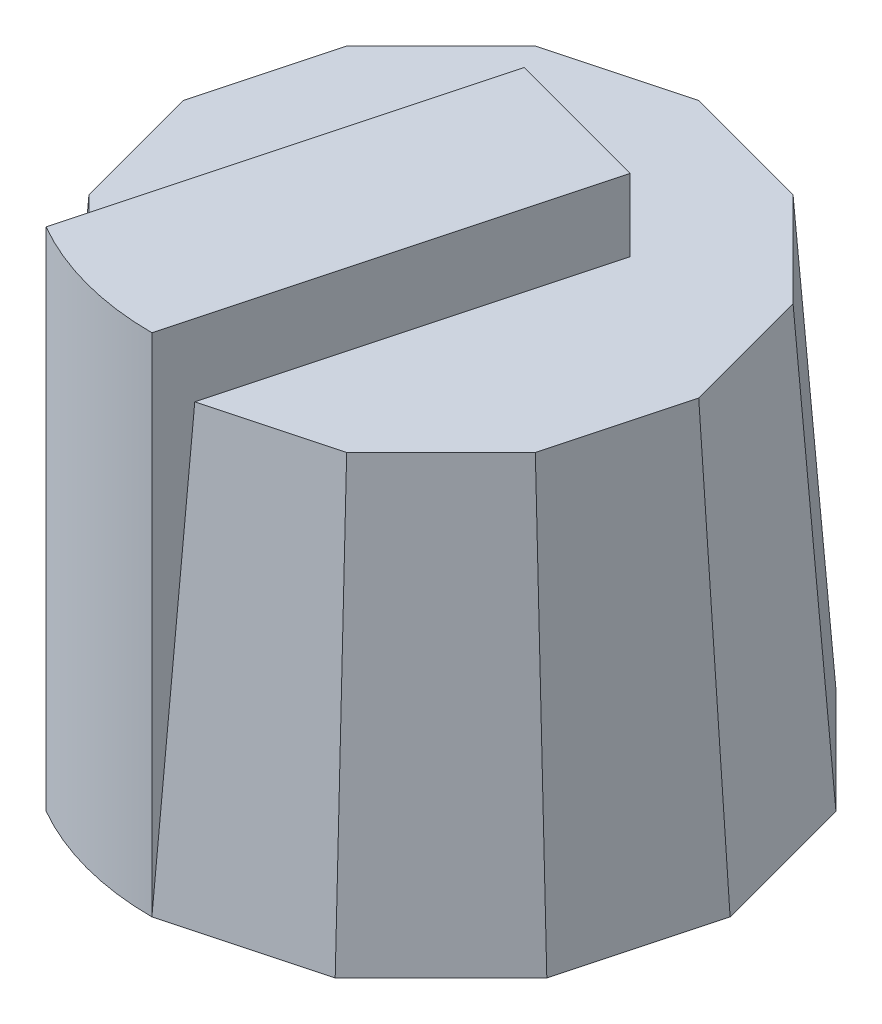
ISO-10303-21;
HEADER;
FILE_DESCRIPTION(('STEP AP214'),'2;1');
FILE_NAME('part.step','',(''),(''),'','','');
FILE_SCHEMA(('AUTOMOTIVE_DESIGN { 1 0 10303 214 1 1 1 1 }'));
ENDSEC;
DATA;
#1=APPLICATION_CONTEXT('core data for automotive mechanical design processes');
#2=APPLICATION_PROTOCOL_DEFINITION('international standard','automotive_design',2000,#1);
#3=PRODUCT_CONTEXT('',#1,'mechanical');
#4=PRODUCT('Part','Part','',(#3));
#5=PRODUCT_RELATED_PRODUCT_CATEGORY('part','',(#4));
#6=PRODUCT_DEFINITION_FORMATION('','',#4);
#7=PRODUCT_DEFINITION_CONTEXT('part definition',#1,'design');
#8=PRODUCT_DEFINITION('design','',#6,#7);
#9=PRODUCT_DEFINITION_SHAPE('','',#8);
#10=(LENGTH_UNIT() NAMED_UNIT(*) SI_UNIT(.MILLI.,.METRE.));
#11=(NAMED_UNIT(*) PLANE_ANGLE_UNIT() SI_UNIT($,.RADIAN.));
#12=(NAMED_UNIT(*) SI_UNIT($,.STERADIAN.) SOLID_ANGLE_UNIT());
#13=UNCERTAINTY_MEASURE_WITH_UNIT(LENGTH_MEASURE(1.E-05),#10,'distance_accuracy_value','');
#14=(GEOMETRIC_REPRESENTATION_CONTEXT(3) GLOBAL_UNCERTAINTY_ASSIGNED_CONTEXT((#13)) GLOBAL_UNIT_ASSIGNED_CONTEXT((#10,
#11,#12)) REPRESENTATION_CONTEXT('',''));
#15=CARTESIAN_POINT('',(0.,0.,0.));
#16=DIRECTION('',(0.,0.,1.));
#17=DIRECTION('',(1.,0.,0.));
#18=AXIS2_PLACEMENT_3D('',#15,#16,#17);
#19=CARTESIAN_POINT('',(-17.3205080756887,0.,10.0000000000001));
#20=DIRECTION('',(-0.705384304606635,0.0697564737441253,0.705384304606645));
#21=DIRECTION('',(0.707106781186553,0.,0.707106781186543));
#22=AXIS2_PLACEMENT_3D('',#19,#20,#21);
#23=PLANE('',#22);
#24=DIRECTION('',(0.020830427948224,0.99675601436554,-0.0777402154461769));
#25=VECTOR('',#24,1.);
#26=CARTESIAN_POINT('',(-9.99132186542976,0.415257086784016,17.2881208365582));
#27=LINE('',#26,#25);
#28=CARTESIAN_POINT('',(-9.3730533556453,30.,14.9807113453227));
#29=VERTEX_POINT('',#28);
#30=CARTESIAN_POINT('',(-9.99999999999987,0.,17.3205080756888));
#31=VERTEX_POINT('',#30);
#32=EDGE_CURVE('E216',#29,#31,#27,.F.);
#33=ORIENTED_EDGE('',*,*,#32,.F.);
#34=DIRECTION('',(-0.707106781186553,0.,-0.707106781186543));
#35=VECTOR('',#34,1.);
#36=CARTESIAN_POINT('',(-15.8371363883283,30.,8.51662831263974));
#37=LINE('',#36,#35);
#38=CARTESIAN_POINT('',(-15.4396681426249,30.,8.91409655834314));
#39=VERTEX_POINT('',#38);
#40=EDGE_CURVE('E308',#39,#29,#37,.F.);
#41=ORIENTED_EDGE('',*,*,#40,.F.);
#42=DIRECTION('',(-0.0625310213997539,-0.997389841110421,0.0361023020378508));
#43=VECTOR('',#42,1.);
#44=CARTESIAN_POINT('',(-17.3205080756887,0.,10.0000000000001));
#45=LINE('',#44,#43);
#46=CARTESIAN_POINT('',(-17.3205080756887,0.,10.0000000000001));
#47=VERTEX_POINT('',#46);
#48=EDGE_CURVE('E257',#39,#47,#45,.T.);
#49=ORIENTED_EDGE('',*,*,#48,.T.);
#50=DIRECTION('',(0.707106781186553,0.,0.707106781186542));
#51=VECTOR('',#50,1.);
#52=CARTESIAN_POINT('',(-17.3205080756887,0.,10.0000000000001));
#53=LINE('',#52,#51);
#54=EDGE_CURVE('E183',#47,#31,#53,.T.);
#55=ORIENTED_EDGE('',*,*,#54,.T.);
#56=EDGE_LOOP('',(#33,#41,#49,#55));
#57=FACE_BOUND('',#56,.T.);
#58=ADVANCED_FACE('F39',(#57),#23,.T.);
#59=CARTESIAN_POINT('',(1.4658413372004E-13,0.,20.));
#60=DIRECTION('',(0.258188574916858,0.0697564737441253,0.963572879523489));
#61=DIRECTION('',(0.965925826289066,0.,-0.258819045102528));
#62=AXIS2_PLACEMENT_3D('',#59,#60,#61);
#63=PLANE('',#62);
#64=DIRECTION('',(-0.0208304279482239,-0.99675601436554,0.0777402154461768));
#65=VECTOR('',#64,1.);
#66=CARTESIAN_POINT('',(1.4658413372004E-13,0.,20.));
#67=LINE('',#66,#65);
#68=CARTESIAN_POINT('',(1.63931368479808E-13,0.,20.));
#69=VERTEX_POINT('',#68);
#70=CARTESIAN_POINT('',(0.626946644354719,30.,17.6602032696338));
#71=VERTEX_POINT('',#70);
#72=EDGE_CURVE('E151',#69,#71,#67,.F.);
#73=ORIENTED_EDGE('',*,*,#72,.F.);
#74=DIRECTION('',(0.965925826289066,0.,-0.258819045102528));
#75=VECTOR('',#74,1.);
#76=CARTESIAN_POINT('',(1.4658413372004E-13,0.,20.));
#77=LINE('',#76,#75);
#78=CARTESIAN_POINT('',(10.0000000000001,0.,17.3205080756887));
#79=VERTEX_POINT('',#78);
#80=EDGE_CURVE('E168',#69,#79,#77,.T.);
#81=ORIENTED_EDGE('',*,*,#80,.T.);
#82=DIRECTION('',(0.0361023020378508,-0.997389841110421,0.0625310213997539));
#83=VECTOR('',#82,1.);
#84=CARTESIAN_POINT('',(10.0000000000001,0.,17.3205080756887));
#85=LINE('',#84,#83);
#86=CARTESIAN_POINT('',(8.91409655834314,30.,15.4396681426249));
#87=VERTEX_POINT('',#86);
#88=EDGE_CURVE('E254',#87,#79,#85,.T.);
#89=ORIENTED_EDGE('',*,*,#88,.F.);
#90=DIRECTION('',(-0.965925826289066,0.,0.258819045102528));
#91=VECTOR('',#90,1.);
#92=CARTESIAN_POINT('',(-0.542951720828356,30.,17.9736765918111));
#93=LINE('',#92,#91);
#94=EDGE_CURVE('E170',#71,#87,#93,.F.);
#95=ORIENTED_EDGE('',*,*,#94,.F.);
#96=EDGE_LOOP('',(#73,#81,#89,#95));
#97=FACE_BOUND('',#96,.T.);
#98=ADVANCED_FACE('F166',(#97),#63,.T.);
#99=CARTESIAN_POINT('',(0.,30.,0.));
#100=DIRECTION('',(0.,1.,0.));
#101=DIRECTION('',(0.,0.,1.));
#102=AXIS2_PLACEMENT_3D('',#99,#100,#101);
#103=PLANE('',#102);
#104=ORIENTED_EDGE('',*,*,#40,.T.);
#105=DIRECTION('',(0.258819045102512,0.,-0.965925826289071));
#106=VECTOR('',#105,1.);
#107=CARTESIAN_POINT('',(-5.00000000000006,30.,-1.33974596215558));
#108=LINE('',#107,#106);
#109=CARTESIAN_POINT('',(-3.01188578223208,30.,-8.75948923411603));
#110=VERTEX_POINT('',#109);
#111=EDGE_CURVE('E62',#29,#110,#108,.T.);
#112=ORIENTED_EDGE('',*,*,#111,.T.);
#113=DIRECTION('',(0.965925826289071,0.,0.258819045102512));
#114=VECTOR('',#113,1.);
#115=CARTESIAN_POINT('',(1.98811421776798,30.,-7.41974327196045));
#116=LINE('',#115,#114);
#117=CARTESIAN_POINT('',(6.98811421776796,30.,-6.07999730980489));
#118=VERTEX_POINT('',#117);
#119=EDGE_CURVE('E57',#110,#118,#116,.T.);
#120=ORIENTED_EDGE('',*,*,#119,.T.);
#121=DIRECTION('',(-0.258819045102512,0.,0.965925826289071));
#122=VECTOR('',#121,1.);
#123=CARTESIAN_POINT('',(4.99999999999997,30.,1.33974596215555));
#124=LINE('',#123,#122);
#125=EDGE_CURVE('E172',#118,#71,#124,.T.);
#126=ORIENTED_EDGE('',*,*,#125,.T.);
#127=ORIENTED_EDGE('',*,*,#94,.T.);
#128=DIRECTION('',(-0.707106781186542,0.,0.707106781186553));
#129=VECTOR('',#128,1.);
#130=CARTESIAN_POINT('',(8.51662831263974,30.,15.8371363883283));
#131=LINE('',#130,#129);
#132=CARTESIAN_POINT('',(15.4396681426251,30.,8.91409655834292));
#133=VERTEX_POINT('',#132);
#134=EDGE_CURVE('E43',#87,#133,#131,.F.);
#135=ORIENTED_EDGE('',*,*,#134,.T.);
#136=DIRECTION('',(-0.258819045102513,0.,0.96592582628907));
#137=VECTOR('',#136,1.);
#138=CARTESIAN_POINT('',(15.2941846675,30.,9.45704827917141));
#139=LINE('',#138,#137);
#140=CARTESIAN_POINT('',(17.828193116686,30.,-1.37885821796515E-13));
#141=VERTEX_POINT('',#140);
#142=EDGE_CURVE('E248',#133,#141,#139,.F.);
#143=ORIENTED_EDGE('',*,*,#142,.T.);
#144=DIRECTION('',(0.258819045102528,0.,0.965925826289066));
#145=VECTOR('',#144,1.);
#146=CARTESIAN_POINT('',(17.9736765918111,30.,0.542951720828348));
#147=LINE('',#146,#145);
#148=CARTESIAN_POINT('',(15.4396681426249,30.,-8.91409655834316));
#149=VERTEX_POINT('',#148);
#150=EDGE_CURVE('E287',#141,#149,#147,.F.);
#151=ORIENTED_EDGE('',*,*,#150,.T.);
#152=DIRECTION('',(0.707106781186554,0.,0.707106781186541));
#153=VECTOR('',#152,1.);
#154=CARTESIAN_POINT('',(15.8371363883283,30.,-8.51662831263976));
#155=LINE('',#154,#153);
#156=CARTESIAN_POINT('',(8.91409655834286,30.,-15.4396681426251));
#157=VERTEX_POINT('',#156);
#158=EDGE_CURVE('E290',#149,#157,#155,.F.);
#159=ORIENTED_EDGE('',*,*,#158,.T.);
#160=DIRECTION('',(0.965925826289071,0.,0.258819045102511));
#161=VECTOR('',#160,1.);
#162=CARTESIAN_POINT('',(9.45704827917135,30.,-15.2941846675));
#163=LINE('',#162,#161);
#164=CARTESIAN_POINT('',(-1.574747435523E-13,30.,-17.8281931166861));
#165=VERTEX_POINT('',#164);
#166=EDGE_CURVE('E293',#157,#165,#163,.F.);
#167=ORIENTED_EDGE('',*,*,#166,.T.);
#168=DIRECTION('',(0.965925826289066,0.,-0.258819045102528));
#169=VECTOR('',#168,1.);
#170=CARTESIAN_POINT('',(0.542951720828326,30.,-17.9736765918111));
#171=LINE('',#170,#169);
#172=CARTESIAN_POINT('',(-8.91409655834315,30.,-15.4396681426249));
#173=VERTEX_POINT('',#172);
#174=EDGE_CURVE('E296',#165,#173,#171,.F.);
#175=ORIENTED_EDGE('',*,*,#174,.T.);
#176=DIRECTION('',(0.707106781186541,0.,-0.707106781186554));
#177=VECTOR('',#176,1.);
#178=CARTESIAN_POINT('',(-8.51662831263975,30.,-15.8371363883283));
#179=LINE('',#178,#177);
#180=CARTESIAN_POINT('',(-15.4396681426251,30.,-8.91409655834291));
#181=VERTEX_POINT('',#180);
#182=EDGE_CURVE('E299',#173,#181,#179,.F.);
#183=ORIENTED_EDGE('',*,*,#182,.T.);
#184=DIRECTION('',(0.258819045102514,0.,-0.96592582628907));
#185=VECTOR('',#184,1.);
#186=CARTESIAN_POINT('',(-15.2941846675,30.,-9.4570482791714));
#187=LINE('',#186,#185);
#188=CARTESIAN_POINT('',(-17.8281931166861,30.,1.34663621097226E-13));
#189=VERTEX_POINT('',#188);
#190=EDGE_CURVE('E302',#181,#189,#187,.F.);
#191=ORIENTED_EDGE('',*,*,#190,.T.);
#192=DIRECTION('',(-0.258819045102529,0.,-0.965925826289066));
#193=VECTOR('',#192,1.);
#194=CARTESIAN_POINT('',(-17.9736765918111,30.,-0.542951720828353));
#195=LINE('',#194,#193);
#196=EDGE_CURVE('E305',#189,#39,#195,.F.);
#197=ORIENTED_EDGE('',*,*,#196,.T.);
#198=EDGE_LOOP('',(#104,#112,#120,#126,#127,#135,#143,#151,#159,#167,#175,#183,#191,#197));
#199=FACE_BOUND('',#198,.T.);
#200=ADVANCED_FACE('F314',(#199),#103,.T.);
#201=CARTESIAN_POINT('',(17.3205080756888,0.,9.99999999999988));
#202=DIRECTION('',(0.963572879523492,0.0697564737441253,0.258188574916843));
#203=DIRECTION('',(0.258819045102513,0.,-0.96592582628907));
#204=AXIS2_PLACEMENT_3D('',#201,#202,#203);
#205=PLANE('',#204);
#206=DIRECTION('',(0.258819045102513,0.,-0.96592582628907));
#207=VECTOR('',#206,1.);
#208=CARTESIAN_POINT('',(17.3205080756888,0.,9.99999999999988));
#209=LINE('',#208,#207);
#210=CARTESIAN_POINT('',(17.3205080756888,0.,9.99999999999988));
#211=VERTEX_POINT('',#210);
#212=CARTESIAN_POINT('',(20.,0.,-1.54968630520594E-13));
#213=VERTEX_POINT('',#212);
#214=EDGE_CURVE('E220',#211,#213,#209,.T.);
#215=ORIENTED_EDGE('',*,*,#214,.T.);
#216=DIRECTION('',(0.0722046040757007,-0.997389841110421,0.));
#217=VECTOR('',#216,1.);
#218=CARTESIAN_POINT('',(20.,0.,-1.54968630520594E-13));
#219=LINE('',#218,#217);
#220=EDGE_CURVE('E11',#141,#213,#219,.T.);
#221=ORIENTED_EDGE('',*,*,#220,.F.);
#222=ORIENTED_EDGE('',*,*,#142,.F.);
#223=DIRECTION('',(0.0625310213997545,-0.997389841110421,0.0361023020378499));
#224=VECTOR('',#223,1.);
#225=CARTESIAN_POINT('',(17.3205080756888,0.,9.99999999999988));
#226=LINE('',#225,#224);
#227=EDGE_CURVE('E250',#133,#211,#226,.T.);
#228=ORIENTED_EDGE('',*,*,#227,.T.);
#229=EDGE_LOOP('',(#215,#221,#222,#228));
#230=FACE_BOUND('',#229,.T.);
#231=ADVANCED_FACE('F320',(#230),#205,.T.);
#232=CARTESIAN_POINT('',(20.,0.,-1.54968630520594E-13));
#233=DIRECTION('',(0.963572879523488,0.0697564737441253,-0.258188574916858));
#234=DIRECTION('',(-0.258819045102528,0.,-0.965925826289066));
#235=AXIS2_PLACEMENT_3D('',#232,#233,#234);
#236=PLANE('',#235);
#237=DIRECTION('',(-0.258819045102528,0.,-0.965925826289066));
#238=VECTOR('',#237,1.);
#239=CARTESIAN_POINT('',(20.,0.,-1.54968630520594E-13));
#240=LINE('',#239,#238);
#241=CARTESIAN_POINT('',(17.3205080756887,0.,-10.0000000000002));
#242=VERTEX_POINT('',#241);
#243=EDGE_CURVE('E224',#213,#242,#240,.T.);
#244=ORIENTED_EDGE('',*,*,#243,.T.);
#245=DIRECTION('',(0.0625310213997539,-0.997389841110421,-0.0361023020378509));
#246=VECTOR('',#245,1.);
#247=CARTESIAN_POINT('',(17.3205080756887,0.,-10.0000000000002));
#248=LINE('',#247,#246);
#249=EDGE_CURVE('E49',#149,#242,#248,.T.);
#250=ORIENTED_EDGE('',*,*,#249,.F.);
#251=ORIENTED_EDGE('',*,*,#150,.F.);
#252=ORIENTED_EDGE('',*,*,#220,.T.);
#253=EDGE_LOOP('',(#244,#250,#251,#252));
#254=FACE_BOUND('',#253,.T.);
#255=ADVANCED_FACE('F41',(#254),#236,.T.);
#256=CARTESIAN_POINT('',(17.3205080756887,0.,-10.0000000000002));
#257=DIRECTION('',(0.705384304606633,0.0697564737441253,-0.705384304606646));
#258=DIRECTION('',(-0.707106781186554,0.,-0.707106781186541));
#259=AXIS2_PLACEMENT_3D('',#256,#257,#258);
#260=PLANE('',#259);
#261=DIRECTION('',(-0.707106781186554,0.,-0.707106781186541));
#262=VECTOR('',#261,1.);
#263=CARTESIAN_POINT('',(17.3205080756887,0.,-10.0000000000002));
#264=LINE('',#263,#262);
#265=CARTESIAN_POINT('',(9.99999999999982,0.,-17.3205080756889));
#266=VERTEX_POINT('',#265);
#267=EDGE_CURVE('E227',#242,#266,#264,.T.);
#268=ORIENTED_EDGE('',*,*,#267,.T.);
#269=DIRECTION('',(0.0361023020378498,-0.997389841110421,-0.0625310213997546));
#270=VECTOR('',#269,1.);
#271=CARTESIAN_POINT('',(9.99999999999982,0.,-17.3205080756889));
#272=LINE('',#271,#270);
#273=EDGE_CURVE('E277',#157,#266,#272,.T.);
#274=ORIENTED_EDGE('',*,*,#273,.F.);
#275=ORIENTED_EDGE('',*,*,#158,.F.);
#276=ORIENTED_EDGE('',*,*,#249,.T.);
#277=EDGE_LOOP('',(#268,#274,#275,#276));
#278=FACE_BOUND('',#277,.T.);
#279=ADVANCED_FACE('F328',(#278),#260,.T.);
#280=CARTESIAN_POINT('',(9.99999999999982,0.,-17.3205080756889));
#281=DIRECTION('',(0.258188574916841,0.0697564737441253,-0.963572879523493));
#282=DIRECTION('',(-0.965925826289071,0.,-0.258819045102511));
#283=AXIS2_PLACEMENT_3D('',#280,#281,#282);
#284=PLANE('',#283);
#285=DIRECTION('',(-0.965925826289071,0.,-0.258819045102511));
#286=VECTOR('',#285,1.);
#287=CARTESIAN_POINT('',(9.99999999999982,0.,-17.3205080756889));
#288=LINE('',#287,#286);
#289=CARTESIAN_POINT('',(-1.76650007965611E-13,0.,-20.));
#290=VERTEX_POINT('',#289);
#291=EDGE_CURVE('E230',#266,#290,#288,.T.);
#292=ORIENTED_EDGE('',*,*,#291,.T.);
#293=DIRECTION('',(0.,-0.997389841110421,-0.0722046040757007));
#294=VECTOR('',#293,1.);
#295=CARTESIAN_POINT('',(-1.76650007965611E-13,0.,-20.));
#296=LINE('',#295,#294);
#297=EDGE_CURVE('E273',#165,#290,#296,.T.);
#298=ORIENTED_EDGE('',*,*,#297,.F.);
#299=ORIENTED_EDGE('',*,*,#166,.F.);
#300=ORIENTED_EDGE('',*,*,#273,.T.);
#301=EDGE_LOOP('',(#292,#298,#299,#300));
#302=FACE_BOUND('',#301,.T.);
#303=ADVANCED_FACE('F332',(#302),#284,.T.);
#304=CARTESIAN_POINT('',(-1.76650007965611E-13,0.,-20.));
#305=DIRECTION('',(-0.258188574916858,0.0697564737441253,-0.963572879523488));
#306=DIRECTION('',(-0.965925826289066,0.,0.258819045102528));
#307=AXIS2_PLACEMENT_3D('',#304,#305,#306);
#308=PLANE('',#307);
#309=DIRECTION('',(-0.965925826289066,0.,0.258819045102528));
#310=VECTOR('',#309,1.);
#311=CARTESIAN_POINT('',(-1.76650007965611E-13,0.,-20.));
#312=LINE('',#311,#310);
#313=CARTESIAN_POINT('',(-10.0000000000001,0.,-17.3205080756887));
#314=VERTEX_POINT('',#313);
#315=EDGE_CURVE('E233',#290,#314,#312,.T.);
#316=ORIENTED_EDGE('',*,*,#315,.T.);
#317=DIRECTION('',(-0.0361023020378509,-0.997389841110421,-0.0625310213997539));
#318=VECTOR('',#317,1.);
#319=CARTESIAN_POINT('',(-10.0000000000001,0.,-17.3205080756887));
#320=LINE('',#319,#318);
#321=EDGE_CURVE('E269',#173,#314,#320,.T.);
#322=ORIENTED_EDGE('',*,*,#321,.F.);
#323=ORIENTED_EDGE('',*,*,#174,.F.);
#324=ORIENTED_EDGE('',*,*,#297,.T.);
#325=EDGE_LOOP('',(#316,#322,#323,#324));
#326=FACE_BOUND('',#325,.T.);
#327=ADVANCED_FACE('F337',(#326),#308,.T.);
#328=CARTESIAN_POINT('',(-10.0000000000001,0.,-17.3205080756887));
#329=DIRECTION('',(-0.705384304606646,0.0697564737441253,-0.705384304606633));
#330=DIRECTION('',(-0.707106781186541,0.,0.707106781186554));
#331=AXIS2_PLACEMENT_3D('',#328,#329,#330);
#332=PLANE('',#331);
#333=DIRECTION('',(-0.707106781186541,0.,0.707106781186554));
#334=VECTOR('',#333,1.);
#335=CARTESIAN_POINT('',(-10.0000000000001,0.,-17.3205080756887));
#336=LINE('',#335,#334);
#337=CARTESIAN_POINT('',(-17.3205080756888,0.,-9.99999999999987));
#338=VERTEX_POINT('',#337);
#339=EDGE_CURVE('E236',#314,#338,#336,.T.);
#340=ORIENTED_EDGE('',*,*,#339,.T.);
#341=DIRECTION('',(-0.0625310213997545,-0.997389841110421,-0.0361023020378498));
#342=VECTOR('',#341,1.);
#343=CARTESIAN_POINT('',(-17.3205080756888,0.,-9.99999999999987));
#344=LINE('',#343,#342);
#345=EDGE_CURVE('E265',#181,#338,#344,.T.);
#346=ORIENTED_EDGE('',*,*,#345,.F.);
#347=ORIENTED_EDGE('',*,*,#182,.F.);
#348=ORIENTED_EDGE('',*,*,#321,.T.);
#349=EDGE_LOOP('',(#340,#346,#347,#348));
#350=FACE_BOUND('',#349,.T.);
#351=ADVANCED_FACE('F343',(#350),#332,.T.);
#352=CARTESIAN_POINT('',(-17.3205080756888,0.,-9.99999999999987));
#353=DIRECTION('',(-0.963572879523492,0.0697564737441253,-0.258188574916844));
#354=DIRECTION('',(-0.258819045102514,0.,0.96592582628907));
#355=AXIS2_PLACEMENT_3D('',#352,#353,#354);
#356=PLANE('',#355);
#357=DIRECTION('',(-0.258819045102514,0.,0.96592582628907));
#358=VECTOR('',#357,1.);
#359=CARTESIAN_POINT('',(-17.3205080756888,0.,-9.99999999999987));
#360=LINE('',#359,#358);
#361=CARTESIAN_POINT('',(-20.,0.,1.51224076726904E-13));
#362=VERTEX_POINT('',#361);
#363=EDGE_CURVE('E239',#338,#362,#360,.T.);
#364=ORIENTED_EDGE('',*,*,#363,.T.);
#365=DIRECTION('',(-0.0722046040757006,-0.997389841110421,0.));
#366=VECTOR('',#365,1.);
#367=CARTESIAN_POINT('',(-20.,0.,1.51224076726904E-13));
#368=LINE('',#367,#366);
#369=EDGE_CURVE('E261',#189,#362,#368,.T.);
#370=ORIENTED_EDGE('',*,*,#369,.F.);
#371=ORIENTED_EDGE('',*,*,#190,.F.);
#372=ORIENTED_EDGE('',*,*,#345,.T.);
#373=EDGE_LOOP('',(#364,#370,#371,#372));
#374=FACE_BOUND('',#373,.T.);
#375=ADVANCED_FACE('F347',(#374),#356,.T.);
#376=CARTESIAN_POINT('',(-20.,0.,1.51224076726904E-13));
#377=DIRECTION('',(-0.963572879523488,0.0697564737441253,0.258188574916858));
#378=DIRECTION('',(0.258819045102529,0.,0.965925826289066));
#379=AXIS2_PLACEMENT_3D('',#376,#377,#378);
#380=PLANE('',#379);
#381=DIRECTION('',(0.258819045102529,0.,0.965925826289066));
#382=VECTOR('',#381,1.);
#383=CARTESIAN_POINT('',(-20.,0.,1.51224076726904E-13));
#384=LINE('',#383,#382);
#385=EDGE_CURVE('E242',#362,#47,#384,.T.);
#386=ORIENTED_EDGE('',*,*,#385,.T.);
#387=ORIENTED_EDGE('',*,*,#48,.F.);
#388=ORIENTED_EDGE('',*,*,#196,.F.);
#389=ORIENTED_EDGE('',*,*,#369,.T.);
#390=EDGE_LOOP('',(#386,#387,#388,#389));
#391=FACE_BOUND('',#390,.T.);
#392=ADVANCED_FACE('F352',(#391),#380,.T.);
#393=CARTESIAN_POINT('',(10.0000000000001,0.,17.3205080756887));
#394=DIRECTION('',(0.705384304606645,0.0697564737441253,0.705384304606635));
#395=DIRECTION('',(0.707106781186542,0.,-0.707106781186553));
#396=AXIS2_PLACEMENT_3D('',#393,#394,#395);
#397=PLANE('',#396);
#398=DIRECTION('',(0.707106781186543,0.,-0.707106781186553));
#399=VECTOR('',#398,1.);
#400=CARTESIAN_POINT('',(10.0000000000001,0.,17.3205080756887));
#401=LINE('',#400,#399);
#402=EDGE_CURVE('E181',#79,#211,#401,.T.);
#403=ORIENTED_EDGE('',*,*,#402,.T.);
#404=ORIENTED_EDGE('',*,*,#227,.F.);
#405=ORIENTED_EDGE('',*,*,#134,.F.);
#406=ORIENTED_EDGE('',*,*,#88,.T.);
#407=EDGE_LOOP('',(#403,#404,#405,#406));
#408=FACE_BOUND('',#407,.T.);
#409=ADVANCED_FACE('F318',(#408),#397,.T.);
#410=CARTESIAN_POINT('',(0.,0.,0.));
#411=DIRECTION('',(0.,1.,0.));
#412=DIRECTION('',(0.,0.,1.));
#413=AXIS2_PLACEMENT_3D('',#410,#411,#412);
#414=PLANE('',#413);
#415=ORIENTED_EDGE('',*,*,#80,.F.);
#416=CARTESIAN_POINT('',(0.,0.,0.));
#417=DIRECTION('',(0.,-1.,0.));
#418=DIRECTION('',(0.,0.,1.));
#419=AXIS2_PLACEMENT_3D('',#416,#417,#418);
#420=CIRCLE('',#419,20.);
#421=EDGE_CURVE('E179',#69,#31,#420,.T.);
#422=ORIENTED_EDGE('',*,*,#421,.T.);
#423=ORIENTED_EDGE('',*,*,#54,.F.);
#424=ORIENTED_EDGE('',*,*,#385,.F.);
#425=ORIENTED_EDGE('',*,*,#363,.F.);
#426=ORIENTED_EDGE('',*,*,#339,.F.);
#427=ORIENTED_EDGE('',*,*,#315,.F.);
#428=ORIENTED_EDGE('',*,*,#291,.F.);
#429=ORIENTED_EDGE('',*,*,#267,.F.);
#430=ORIENTED_EDGE('',*,*,#243,.F.);
#431=ORIENTED_EDGE('',*,*,#214,.F.);
#432=ORIENTED_EDGE('',*,*,#402,.F.);
#433=EDGE_LOOP('',(#415,#422,#423,#424,#425,#426,#427,#428,#429,#430,#431,#432));
#434=FACE_BOUND('',#433,.T.);
#435=ADVANCED_FACE('F177',(#434),#414,.F.);
#436=CARTESIAN_POINT('',(-3.01188578223207,35.,-8.75948923411603));
#437=DIRECTION('',(0.965925826289071,0.,0.258819045102512));
#438=DIRECTION('',(0.258819045102512,0.,-0.965925826289071));
#439=AXIS2_PLACEMENT_3D('',#436,#437,#438);
#440=PLANE('',#439);
#441=ORIENTED_EDGE('',*,*,#111,.F.);
#442=ORIENTED_EDGE('',*,*,#32,.T.);
#443=DIRECTION('',(0.,1.,0.));
#444=VECTOR('',#443,1.);
#445=CARTESIAN_POINT('',(-9.99999999999988,35.,17.3205080756889));
#446=LINE('',#445,#444);
#447=CARTESIAN_POINT('',(-9.99999999999988,35.,17.3205080756889));
#448=VERTEX_POINT('',#447);
#449=EDGE_CURVE('E161',#31,#448,#446,.T.);
#450=ORIENTED_EDGE('',*,*,#449,.T.);
#451=DIRECTION('',(-0.258819045102512,0.,0.965925826289071));
#452=VECTOR('',#451,1.);
#453=CARTESIAN_POINT('',(-3.01188578223207,35.,-8.75948923411603));
#454=LINE('',#453,#452);
#455=CARTESIAN_POINT('',(-3.01188578223207,35.,-8.75948923411603));
#456=VERTEX_POINT('',#455);
#457=EDGE_CURVE('E207',#456,#448,#454,.T.);
#458=ORIENTED_EDGE('',*,*,#457,.F.);
#459=DIRECTION('',(0.,1.,0.));
#460=VECTOR('',#459,1.);
#461=CARTESIAN_POINT('',(-3.01188578223207,35.,-8.75948923411603));
#462=LINE('',#461,#460);
#463=EDGE_CURVE('E160',#110,#456,#462,.T.);
#464=ORIENTED_EDGE('',*,*,#463,.F.);
#465=EDGE_LOOP('',(#441,#442,#450,#458,#464));
#466=FACE_BOUND('',#465,.T.);
#467=ADVANCED_FACE('F357',(#466),#440,.F.);
#468=CARTESIAN_POINT('',(6.98811421776796,35.,-6.0799973098049));
#469=DIRECTION('',(-0.965925826289071,0.,-0.258819045102512));
#470=DIRECTION('',(-0.258819045102512,0.,0.965925826289071));
#471=AXIS2_PLACEMENT_3D('',#468,#469,#470);
#472=PLANE('',#471);
#473=DIRECTION('',(0.,-1.,0.));
#474=VECTOR('',#473,1.);
#475=CARTESIAN_POINT('',(1.50920942409982E-13,35.,20.));
#476=LINE('',#475,#474);
#477=CARTESIAN_POINT('',(1.50920942409982E-13,35.,20.));
#478=VERTEX_POINT('',#477);
#479=EDGE_CURVE('E148',#478,#69,#476,.T.);
#480=ORIENTED_EDGE('',*,*,#479,.T.);
#481=ORIENTED_EDGE('',*,*,#72,.T.);
#482=ORIENTED_EDGE('',*,*,#125,.F.);
#483=DIRECTION('',(0.,-1.,0.));
#484=VECTOR('',#483,1.);
#485=CARTESIAN_POINT('',(6.98811421776796,35.,-6.0799973098049));
#486=LINE('',#485,#484);
#487=CARTESIAN_POINT('',(6.98811421776796,35.,-6.0799973098049));
#488=VERTEX_POINT('',#487);
#489=EDGE_CURVE('E199',#488,#118,#486,.T.);
#490=ORIENTED_EDGE('',*,*,#489,.F.);
#491=DIRECTION('',(-0.258819045102512,0.,0.965925826289071));
#492=VECTOR('',#491,1.);
#493=CARTESIAN_POINT('',(6.98811421776796,35.,-6.0799973098049));
#494=LINE('',#493,#492);
#495=EDGE_CURVE('E154',#488,#478,#494,.T.);
#496=ORIENTED_EDGE('',*,*,#495,.T.);
#497=EDGE_LOOP('',(#480,#481,#482,#490,#496));
#498=FACE_BOUND('',#497,.T.);
#499=ADVANCED_FACE('F150',(#498),#472,.F.);
#500=CARTESIAN_POINT('',(-3.01188578223207,35.,-8.75948923411603));
#501=DIRECTION('',(0.,-1.,0.));
#502=DIRECTION('',(0.,0.,-1.));
#503=AXIS2_PLACEMENT_3D('',#500,#501,#502);
#504=PLANE('',#503);
#505=ORIENTED_EDGE('',*,*,#457,.T.);
#506=CARTESIAN_POINT('',(0.,35.,0.));
#507=DIRECTION('',(0.,-1.,0.));
#508=DIRECTION('',(0.,0.,1.));
#509=AXIS2_PLACEMENT_3D('',#506,#507,#508);
#510=CIRCLE('',#509,20.);
#511=EDGE_CURVE('E189',#478,#448,#510,.T.);
#512=ORIENTED_EDGE('',*,*,#511,.F.);
#513=ORIENTED_EDGE('',*,*,#495,.F.);
#514=DIRECTION('',(0.965925826289071,0.,0.258819045102512));
#515=VECTOR('',#514,1.);
#516=CARTESIAN_POINT('',(-3.01188578223207,35.,-8.75948923411603));
#517=LINE('',#516,#515);
#518=EDGE_CURVE('E196',#456,#488,#517,.T.);
#519=ORIENTED_EDGE('',*,*,#518,.F.);
#520=EDGE_LOOP('',(#505,#512,#513,#519));
#521=FACE_BOUND('',#520,.T.);
#522=ADVANCED_FACE('F363',(#521),#504,.F.);
#523=CARTESIAN_POINT('',(1.98811421776798,0.,-7.41974327196045));
#524=DIRECTION('',(-0.258819045102512,0.,0.965925826289071));
#525=DIRECTION('',(0.965925826289071,0.,0.258819045102512));
#526=AXIS2_PLACEMENT_3D('',#523,#524,#525);
#527=PLANE('',#526);
#528=ORIENTED_EDGE('',*,*,#119,.F.);
#529=ORIENTED_EDGE('',*,*,#463,.T.);
#530=ORIENTED_EDGE('',*,*,#518,.T.);
#531=ORIENTED_EDGE('',*,*,#489,.T.);
#532=EDGE_LOOP('',(#528,#529,#530,#531));
#533=FACE_BOUND('',#532,.T.);
#534=ADVANCED_FACE('F361',(#533),#527,.F.);
#535=CARTESIAN_POINT('',(0.,35.,0.));
#536=DIRECTION('',(0.,-1.,0.));
#537=DIRECTION('',(0.,0.,-1.));
#538=AXIS2_PLACEMENT_3D('',#535,#536,#537);
#539=CYLINDRICAL_SURFACE('',#538,20.);
#540=ORIENTED_EDGE('',*,*,#421,.F.);
#541=ORIENTED_EDGE('',*,*,#479,.F.);
#542=ORIENTED_EDGE('',*,*,#511,.T.);
#543=ORIENTED_EDGE('',*,*,#449,.F.);
#544=EDGE_LOOP('',(#540,#541,#542,#543));
#545=FACE_BOUND('',#544,.T.);
#546=ADVANCED_FACE('F186',(#545),#539,.T.);
#547=CLOSED_SHELL('',(#58,#98,#200,#231,#255,#279,#303,#327,#351,#375,#392,#409,#435,#467,#499,
#522,#534,#546));
#548=MANIFOLD_SOLID_BREP('B2',#547);
#549=ADVANCED_BREP_SHAPE_REPRESENTATION('',(#18,#548),#14);
#550=SHAPE_DEFINITION_REPRESENTATION(#9,#549);
ENDSEC;
END-ISO-10303-21;
